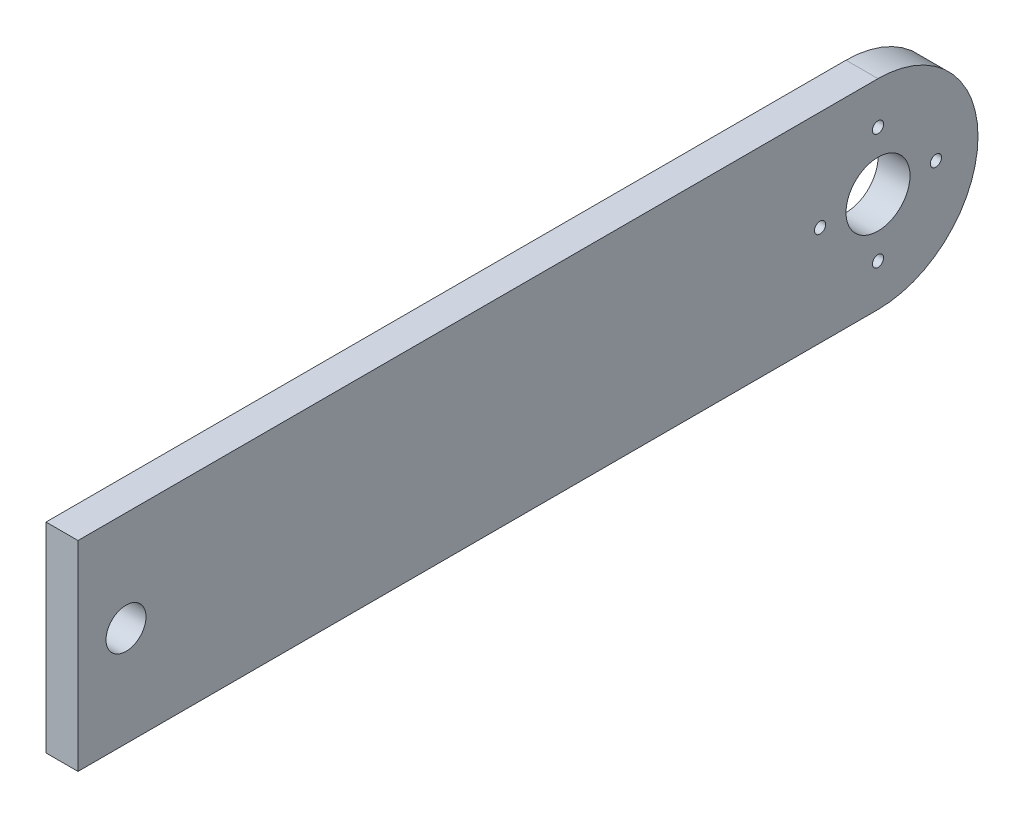
ISO-10303-21;
HEADER;
FILE_DESCRIPTION(('STEP AP214'),'2;1');
FILE_NAME('part.step','',(''),(''),'','','');
FILE_SCHEMA(('AUTOMOTIVE_DESIGN { 1 0 10303 214 1 1 1 1 }'));
ENDSEC;
DATA;
#1=APPLICATION_CONTEXT('core data for automotive mechanical design processes');
#2=APPLICATION_PROTOCOL_DEFINITION('international standard','automotive_design',2000,#1);
#3=PRODUCT_CONTEXT('',#1,'mechanical');
#4=PRODUCT('Part','Part','',(#3));
#5=PRODUCT_RELATED_PRODUCT_CATEGORY('part','',(#4));
#6=PRODUCT_DEFINITION_FORMATION('','',#4);
#7=PRODUCT_DEFINITION_CONTEXT('part definition',#1,'design');
#8=PRODUCT_DEFINITION('design','',#6,#7);
#9=PRODUCT_DEFINITION_SHAPE('','',#8);
#10=(LENGTH_UNIT() NAMED_UNIT(*) SI_UNIT(.MILLI.,.METRE.));
#11=(NAMED_UNIT(*) PLANE_ANGLE_UNIT() SI_UNIT($,.RADIAN.));
#12=(NAMED_UNIT(*) SI_UNIT($,.STERADIAN.) SOLID_ANGLE_UNIT());
#13=UNCERTAINTY_MEASURE_WITH_UNIT(LENGTH_MEASURE(1.E-05),#10,'distance_accuracy_value','');
#14=(GEOMETRIC_REPRESENTATION_CONTEXT(3) GLOBAL_UNCERTAINTY_ASSIGNED_CONTEXT((#13)) GLOBAL_UNIT_ASSIGNED_CONTEXT((#10,
#11,#12)) REPRESENTATION_CONTEXT('',''));
#15=CARTESIAN_POINT('',(0.,0.,0.));
#16=DIRECTION('',(0.,0.,1.));
#17=DIRECTION('',(1.,0.,0.));
#18=AXIS2_PLACEMENT_3D('',#15,#16,#17);
#19=CARTESIAN_POINT('',(4.,0.,0.));
#20=DIRECTION('',(1.,0.,0.));
#21=DIRECTION('',(0.,0.,-1.));
#22=AXIS2_PLACEMENT_3D('',#19,#20,#21);
#23=PLANE('',#22);
#24=CARTESIAN_POINT('',(4.,0.,94.));
#25=DIRECTION('',(1.,0.,0.));
#26=DIRECTION('',(0.,0.,-1.));
#27=AXIS2_PLACEMENT_3D('',#24,#25,#26);
#28=CIRCLE('',#27,2.5);
#29=CARTESIAN_POINT('',(4.,0.,91.5));
#30=VERTEX_POINT('',#29);
#31=EDGE_CURVE('E143',#30,#30,#28,.T.);
#32=ORIENTED_EDGE('',*,*,#31,.F.);
#33=EDGE_LOOP('',(#32));
#34=FACE_BOUND('',#33,.T.);
#35=CARTESIAN_POINT('',(4.,0.,-7.24));
#36=DIRECTION('',(1.,0.,0.));
#37=DIRECTION('',(0.,0.,-1.));
#38=AXIS2_PLACEMENT_3D('',#35,#36,#37);
#39=CIRCLE('',#38,0.700000000000001);
#40=CARTESIAN_POINT('',(4.,0.,-7.94));
#41=VERTEX_POINT('',#40);
#42=EDGE_CURVE('E129',#41,#41,#39,.T.);
#43=ORIENTED_EDGE('',*,*,#42,.F.);
#44=EDGE_LOOP('',(#43));
#45=FACE_BOUND('',#44,.T.);
#46=CARTESIAN_POINT('',(4.,0.,7.24));
#47=DIRECTION('',(1.,0.,0.));
#48=DIRECTION('',(0.,0.,-1.));
#49=AXIS2_PLACEMENT_3D('',#46,#47,#48);
#50=CIRCLE('',#49,0.7);
#51=CARTESIAN_POINT('',(4.,0.,6.54));
#52=VERTEX_POINT('',#51);
#53=EDGE_CURVE('E117',#52,#52,#50,.T.);
#54=ORIENTED_EDGE('',*,*,#53,.F.);
#55=EDGE_LOOP('',(#54));
#56=FACE_BOUND('',#55,.T.);
#57=DIRECTION('',(0.,0.,1.));
#58=VECTOR('',#57,1.);
#59=CARTESIAN_POINT('',(4.,12.5,100.));
#60=LINE('',#59,#58);
#61=CARTESIAN_POINT('',(4.,12.5,0.));
#62=VERTEX_POINT('',#61);
#63=CARTESIAN_POINT('',(4.,12.5,100.));
#64=VERTEX_POINT('',#63);
#65=EDGE_CURVE('E86',#62,#64,#60,.T.);
#66=ORIENTED_EDGE('',*,*,#65,.T.);
#67=DIRECTION('',(0.,-1.,0.));
#68=VECTOR('',#67,1.);
#69=CARTESIAN_POINT('',(4.,12.5,100.));
#70=LINE('',#69,#68);
#71=CARTESIAN_POINT('',(4.,-12.5,100.));
#72=VERTEX_POINT('',#71);
#73=EDGE_CURVE('E81',#64,#72,#70,.T.);
#74=ORIENTED_EDGE('',*,*,#73,.T.);
#75=DIRECTION('',(0.,0.,-1.));
#76=VECTOR('',#75,1.);
#77=CARTESIAN_POINT('',(4.,-12.5,100.));
#78=LINE('',#77,#76);
#79=CARTESIAN_POINT('',(4.,-12.5,0.));
#80=VERTEX_POINT('',#79);
#81=EDGE_CURVE('E84',#72,#80,#78,.T.);
#82=ORIENTED_EDGE('',*,*,#81,.T.);
#83=CARTESIAN_POINT('',(4.,0.,0.));
#84=DIRECTION('',(1.,0.,0.));
#85=DIRECTION('',(0.,0.,-1.));
#86=AXIS2_PLACEMENT_3D('',#83,#84,#85);
#87=CIRCLE('',#86,12.5);
#88=EDGE_CURVE('E51',#80,#62,#87,.T.);
#89=ORIENTED_EDGE('',*,*,#88,.T.);
#90=EDGE_LOOP('',(#66,#74,#82,#89));
#91=FACE_BOUND('',#90,.T.);
#92=CARTESIAN_POINT('',(4.,0.,0.));
#93=DIRECTION('',(1.,0.,0.));
#94=DIRECTION('',(0.,0.,-1.));
#95=AXIS2_PLACEMENT_3D('',#92,#93,#94);
#96=CIRCLE('',#95,4.);
#97=CARTESIAN_POINT('',(4.,0.,-4.));
#98=VERTEX_POINT('',#97);
#99=EDGE_CURVE('E102',#98,#98,#96,.T.);
#100=ORIENTED_EDGE('',*,*,#99,.F.);
#101=EDGE_LOOP('',(#100));
#102=FACE_BOUND('',#101,.T.);
#103=CARTESIAN_POINT('',(4.,7.24,0.));
#104=DIRECTION('',(1.,0.,0.));
#105=DIRECTION('',(0.,0.,-1.));
#106=AXIS2_PLACEMENT_3D('',#103,#104,#105);
#107=CIRCLE('',#106,0.7);
#108=CARTESIAN_POINT('',(4.,7.24,-0.699999999999999));
#109=VERTEX_POINT('',#108);
#110=EDGE_CURVE('E123',#109,#109,#107,.T.);
#111=ORIENTED_EDGE('',*,*,#110,.F.);
#112=EDGE_LOOP('',(#111));
#113=FACE_BOUND('',#112,.T.);
#114=CARTESIAN_POINT('',(4.,-7.24,0.));
#115=DIRECTION('',(1.,0.,0.));
#116=DIRECTION('',(0.,0.,-1.));
#117=AXIS2_PLACEMENT_3D('',#114,#115,#116);
#118=CIRCLE('',#117,0.7);
#119=CARTESIAN_POINT('',(4.,-7.24,-0.700000000000001));
#120=VERTEX_POINT('',#119);
#121=EDGE_CURVE('E135',#120,#120,#118,.T.);
#122=ORIENTED_EDGE('',*,*,#121,.F.);
#123=EDGE_LOOP('',(#122));
#124=FACE_BOUND('',#123,.T.);
#125=ADVANCED_FACE('F33',(#34,#45,#56,#91,#102,#113,#124),#23,.T.);
#126=CARTESIAN_POINT('',(0.,0.,0.));
#127=DIRECTION('',(1.,0.,0.));
#128=DIRECTION('',(0.,0.,-1.));
#129=AXIS2_PLACEMENT_3D('',#126,#127,#128);
#130=PLANE('',#129);
#131=CARTESIAN_POINT('',(0.,0.,94.));
#132=DIRECTION('',(1.,0.,0.));
#133=DIRECTION('',(0.,0.,-1.));
#134=AXIS2_PLACEMENT_3D('',#131,#132,#133);
#135=CIRCLE('',#134,2.5);
#136=CARTESIAN_POINT('',(0.,0.,91.5));
#137=VERTEX_POINT('',#136);
#138=EDGE_CURVE('E37',#137,#137,#135,.T.);
#139=ORIENTED_EDGE('',*,*,#138,.T.);
#140=EDGE_LOOP('',(#139));
#141=FACE_BOUND('',#140,.T.);
#142=DIRECTION('',(0.,0.,1.));
#143=VECTOR('',#142,1.);
#144=CARTESIAN_POINT('',(0.,12.5,100.));
#145=LINE('',#144,#143);
#146=CARTESIAN_POINT('',(0.,12.5,0.));
#147=VERTEX_POINT('',#146);
#148=CARTESIAN_POINT('',(0.,12.5,100.));
#149=VERTEX_POINT('',#148);
#150=EDGE_CURVE('E99',#147,#149,#145,.T.);
#151=ORIENTED_EDGE('',*,*,#150,.F.);
#152=CARTESIAN_POINT('',(0.,0.,0.));
#153=DIRECTION('',(1.,0.,0.));
#154=DIRECTION('',(0.,0.,-1.));
#155=AXIS2_PLACEMENT_3D('',#152,#153,#154);
#156=CIRCLE('',#155,12.5);
#157=CARTESIAN_POINT('',(0.,-12.5,0.));
#158=VERTEX_POINT('',#157);
#159=EDGE_CURVE('E74',#158,#147,#156,.T.);
#160=ORIENTED_EDGE('',*,*,#159,.F.);
#161=DIRECTION('',(0.,0.,-1.));
#162=VECTOR('',#161,1.);
#163=CARTESIAN_POINT('',(0.,-12.5,100.));
#164=LINE('',#163,#162);
#165=CARTESIAN_POINT('',(0.,-12.5,100.));
#166=VERTEX_POINT('',#165);
#167=EDGE_CURVE('E68',#166,#158,#164,.T.);
#168=ORIENTED_EDGE('',*,*,#167,.F.);
#169=DIRECTION('',(0.,-1.,0.));
#170=VECTOR('',#169,1.);
#171=CARTESIAN_POINT('',(0.,12.5,100.));
#172=LINE('',#171,#170);
#173=EDGE_CURVE('E90',#149,#166,#172,.T.);
#174=ORIENTED_EDGE('',*,*,#173,.F.);
#175=EDGE_LOOP('',(#151,#160,#168,#174));
#176=FACE_BOUND('',#175,.T.);
#177=CARTESIAN_POINT('',(0.,0.,0.));
#178=DIRECTION('',(1.,0.,0.));
#179=DIRECTION('',(0.,0.,-1.));
#180=AXIS2_PLACEMENT_3D('',#177,#178,#179);
#181=CIRCLE('',#180,4.);
#182=CARTESIAN_POINT('',(0.,0.,-4.));
#183=VERTEX_POINT('',#182);
#184=EDGE_CURVE('E114',#183,#183,#181,.T.);
#185=ORIENTED_EDGE('',*,*,#184,.T.);
#186=EDGE_LOOP('',(#185));
#187=FACE_BOUND('',#186,.T.);
#188=CARTESIAN_POINT('',(0.,0.,7.24));
#189=DIRECTION('',(1.,0.,0.));
#190=DIRECTION('',(0.,0.,-1.));
#191=AXIS2_PLACEMENT_3D('',#188,#189,#190);
#192=CIRCLE('',#191,0.7);
#193=CARTESIAN_POINT('',(0.,0.,6.54));
#194=VERTEX_POINT('',#193);
#195=EDGE_CURVE('E120',#194,#194,#192,.T.);
#196=ORIENTED_EDGE('',*,*,#195,.T.);
#197=EDGE_LOOP('',(#196));
#198=FACE_BOUND('',#197,.T.);
#199=CARTESIAN_POINT('',(0.,7.24,0.));
#200=DIRECTION('',(1.,0.,0.));
#201=DIRECTION('',(0.,0.,-1.));
#202=AXIS2_PLACEMENT_3D('',#199,#200,#201);
#203=CIRCLE('',#202,0.7);
#204=CARTESIAN_POINT('',(0.,7.24,-0.699999999999999));
#205=VERTEX_POINT('',#204);
#206=EDGE_CURVE('E126',#205,#205,#203,.T.);
#207=ORIENTED_EDGE('',*,*,#206,.T.);
#208=EDGE_LOOP('',(#207));
#209=FACE_BOUND('',#208,.T.);
#210=CARTESIAN_POINT('',(0.,0.,-7.24));
#211=DIRECTION('',(1.,0.,0.));
#212=DIRECTION('',(0.,0.,-1.));
#213=AXIS2_PLACEMENT_3D('',#210,#211,#212);
#214=CIRCLE('',#213,0.700000000000001);
#215=CARTESIAN_POINT('',(0.,0.,-7.94));
#216=VERTEX_POINT('',#215);
#217=EDGE_CURVE('E132',#216,#216,#214,.T.);
#218=ORIENTED_EDGE('',*,*,#217,.T.);
#219=EDGE_LOOP('',(#218));
#220=FACE_BOUND('',#219,.T.);
#221=CARTESIAN_POINT('',(0.,-7.24,0.));
#222=DIRECTION('',(1.,0.,0.));
#223=DIRECTION('',(0.,0.,-1.));
#224=AXIS2_PLACEMENT_3D('',#221,#222,#223);
#225=CIRCLE('',#224,0.7);
#226=CARTESIAN_POINT('',(0.,-7.24,-0.700000000000001));
#227=VERTEX_POINT('',#226);
#228=EDGE_CURVE('E138',#227,#227,#225,.T.);
#229=ORIENTED_EDGE('',*,*,#228,.T.);
#230=EDGE_LOOP('',(#229));
#231=FACE_BOUND('',#230,.T.);
#232=ADVANCED_FACE('F110',(#141,#176,#187,#198,#209,#220,#231),#130,.F.);
#233=CARTESIAN_POINT('',(4.,12.5,100.));
#234=DIRECTION('',(0.,-1.,0.));
#235=DIRECTION('',(0.,0.,-1.));
#236=AXIS2_PLACEMENT_3D('',#233,#234,#235);
#237=PLANE('',#236);
#238=ORIENTED_EDGE('',*,*,#150,.T.);
#239=DIRECTION('',(-1.,0.,0.));
#240=VECTOR('',#239,1.);
#241=CARTESIAN_POINT('',(4.,12.5,100.));
#242=LINE('',#241,#240);
#243=EDGE_CURVE('E11',#64,#149,#242,.T.);
#244=ORIENTED_EDGE('',*,*,#243,.F.);
#245=ORIENTED_EDGE('',*,*,#65,.F.);
#246=DIRECTION('',(-1.,0.,0.));
#247=VECTOR('',#246,1.);
#248=CARTESIAN_POINT('',(4.,12.5,0.));
#249=LINE('',#248,#247);
#250=EDGE_CURVE('E95',#62,#147,#249,.T.);
#251=ORIENTED_EDGE('',*,*,#250,.T.);
#252=EDGE_LOOP('',(#238,#244,#245,#251));
#253=FACE_BOUND('',#252,.T.);
#254=ADVANCED_FACE('F35',(#253),#237,.F.);
#255=CARTESIAN_POINT('',(4.,12.5,100.));
#256=DIRECTION('',(0.,0.,-1.));
#257=DIRECTION('',(-1.,0.,0.));
#258=AXIS2_PLACEMENT_3D('',#255,#256,#257);
#259=PLANE('',#258);
#260=ORIENTED_EDGE('',*,*,#173,.T.);
#261=DIRECTION('',(-1.,0.,0.));
#262=VECTOR('',#261,1.);
#263=CARTESIAN_POINT('',(4.,-12.5,100.));
#264=LINE('',#263,#262);
#265=EDGE_CURVE('E43',#72,#166,#264,.T.);
#266=ORIENTED_EDGE('',*,*,#265,.F.);
#267=ORIENTED_EDGE('',*,*,#73,.F.);
#268=ORIENTED_EDGE('',*,*,#243,.T.);
#269=EDGE_LOOP('',(#260,#266,#267,#268));
#270=FACE_BOUND('',#269,.T.);
#271=ADVANCED_FACE('F89',(#270),#259,.F.);
#272=CARTESIAN_POINT('',(4.,-12.5,100.));
#273=DIRECTION('',(0.,1.,0.));
#274=DIRECTION('',(0.,0.,1.));
#275=AXIS2_PLACEMENT_3D('',#272,#273,#274);
#276=PLANE('',#275);
#277=ORIENTED_EDGE('',*,*,#167,.T.);
#278=DIRECTION('',(-1.,0.,0.));
#279=VECTOR('',#278,1.);
#280=CARTESIAN_POINT('',(4.,-12.5,0.));
#281=LINE('',#280,#279);
#282=EDGE_CURVE('E91',#80,#158,#281,.T.);
#283=ORIENTED_EDGE('',*,*,#282,.F.);
#284=ORIENTED_EDGE('',*,*,#81,.F.);
#285=ORIENTED_EDGE('',*,*,#265,.T.);
#286=EDGE_LOOP('',(#277,#283,#284,#285));
#287=FACE_BOUND('',#286,.T.);
#288=ADVANCED_FACE('F93',(#287),#276,.F.);
#289=CARTESIAN_POINT('',(4.,0.,0.));
#290=DIRECTION('',(-1.,0.,0.));
#291=DIRECTION('',(0.,0.,1.));
#292=AXIS2_PLACEMENT_3D('',#289,#290,#291);
#293=CYLINDRICAL_SURFACE('',#292,12.5);
#294=ORIENTED_EDGE('',*,*,#159,.T.);
#295=ORIENTED_EDGE('',*,*,#250,.F.);
#296=ORIENTED_EDGE('',*,*,#88,.F.);
#297=ORIENTED_EDGE('',*,*,#282,.T.);
#298=EDGE_LOOP('',(#294,#295,#296,#297));
#299=FACE_BOUND('',#298,.T.);
#300=ADVANCED_FACE('F107',(#299),#293,.T.);
#301=CARTESIAN_POINT('',(4.,0.,0.));
#302=DIRECTION('',(-1.,0.,0.));
#303=DIRECTION('',(0.,0.,1.));
#304=AXIS2_PLACEMENT_3D('',#301,#302,#303);
#305=CYLINDRICAL_SURFACE('',#304,4.);
#306=ORIENTED_EDGE('',*,*,#99,.T.);
#307=EDGE_LOOP('',(#306));
#308=FACE_BOUND('',#307,.T.);
#309=ORIENTED_EDGE('',*,*,#184,.F.);
#310=EDGE_LOOP('',(#309));
#311=FACE_BOUND('',#310,.T.);
#312=ADVANCED_FACE('F170',(#308,#311),#305,.F.);
#313=CARTESIAN_POINT('',(4.,0.,7.24));
#314=DIRECTION('',(-1.,0.,0.));
#315=DIRECTION('',(0.,0.,1.));
#316=AXIS2_PLACEMENT_3D('',#313,#314,#315);
#317=CYLINDRICAL_SURFACE('',#316,0.7);
#318=ORIENTED_EDGE('',*,*,#53,.T.);
#319=EDGE_LOOP('',(#318));
#320=FACE_BOUND('',#319,.T.);
#321=ORIENTED_EDGE('',*,*,#195,.F.);
#322=EDGE_LOOP('',(#321));
#323=FACE_BOUND('',#322,.T.);
#324=ADVANCED_FACE('F216',(#320,#323),#317,.F.);
#325=CARTESIAN_POINT('',(4.,7.24,0.));
#326=DIRECTION('',(-1.,0.,0.));
#327=DIRECTION('',(0.,0.,1.));
#328=AXIS2_PLACEMENT_3D('',#325,#326,#327);
#329=CYLINDRICAL_SURFACE('',#328,0.7);
#330=ORIENTED_EDGE('',*,*,#110,.T.);
#331=EDGE_LOOP('',(#330));
#332=FACE_BOUND('',#331,.T.);
#333=ORIENTED_EDGE('',*,*,#206,.F.);
#334=EDGE_LOOP('',(#333));
#335=FACE_BOUND('',#334,.T.);
#336=ADVANCED_FACE('F207',(#332,#335),#329,.F.);
#337=CARTESIAN_POINT('',(4.,0.,-7.24));
#338=DIRECTION('',(-1.,0.,0.));
#339=DIRECTION('',(0.,0.,1.));
#340=AXIS2_PLACEMENT_3D('',#337,#338,#339);
#341=CYLINDRICAL_SURFACE('',#340,0.700000000000001);
#342=ORIENTED_EDGE('',*,*,#42,.T.);
#343=EDGE_LOOP('',(#342));
#344=FACE_BOUND('',#343,.T.);
#345=ORIENTED_EDGE('',*,*,#217,.F.);
#346=EDGE_LOOP('',(#345));
#347=FACE_BOUND('',#346,.T.);
#348=ADVANCED_FACE('F158',(#344,#347),#341,.F.);
#349=CARTESIAN_POINT('',(4.,-7.24,0.));
#350=DIRECTION('',(-1.,0.,0.));
#351=DIRECTION('',(0.,0.,1.));
#352=AXIS2_PLACEMENT_3D('',#349,#350,#351);
#353=CYLINDRICAL_SURFACE('',#352,0.7);
#354=ORIENTED_EDGE('',*,*,#121,.T.);
#355=EDGE_LOOP('',(#354));
#356=FACE_BOUND('',#355,.T.);
#357=ORIENTED_EDGE('',*,*,#228,.F.);
#358=EDGE_LOOP('',(#357));
#359=FACE_BOUND('',#358,.T.);
#360=ADVANCED_FACE('F153',(#356,#359),#353,.F.);
#361=CARTESIAN_POINT('',(-6.,0.,94.));
#362=DIRECTION('',(1.,0.,0.));
#363=DIRECTION('',(0.,0.,-1.));
#364=AXIS2_PLACEMENT_3D('',#361,#362,#363);
#365=CYLINDRICAL_SURFACE('',#364,2.5);
#366=ORIENTED_EDGE('',*,*,#31,.T.);
#367=EDGE_LOOP('',(#366));
#368=FACE_BOUND('',#367,.T.);
#369=ORIENTED_EDGE('',*,*,#138,.F.);
#370=EDGE_LOOP('',(#369));
#371=FACE_BOUND('',#370,.T.);
#372=ADVANCED_FACE('F151',(#368,#371),#365,.F.);
#373=CLOSED_SHELL('',(#125,#232,#254,#271,#288,#300,#312,#324,#336,#348,#360,#372));
#374=MANIFOLD_SOLID_BREP('B2',#373);
#375=ADVANCED_BREP_SHAPE_REPRESENTATION('',(#18,#374),#14);
#376=SHAPE_DEFINITION_REPRESENTATION(#9,#375);
ENDSEC;
END-ISO-10303-21;
